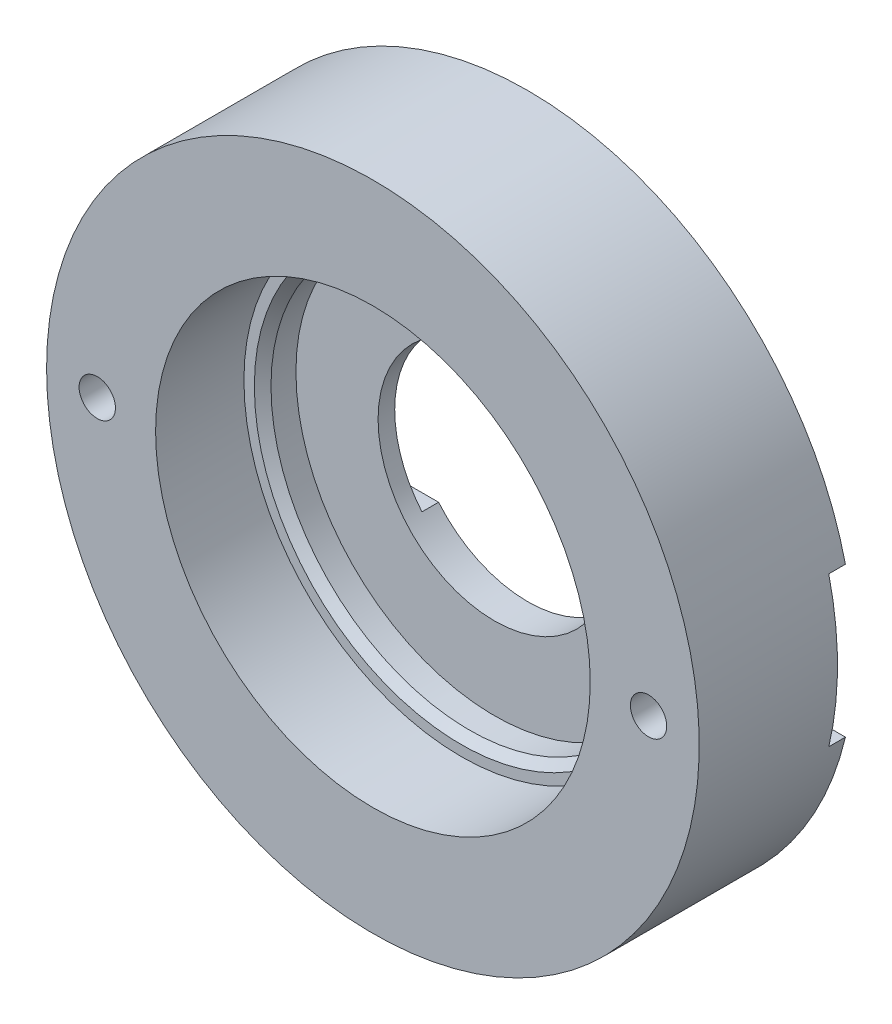
ISO-10303-21;
HEADER;
FILE_DESCRIPTION(('STEP AP214'),'2;1');
FILE_NAME('part.step','',(''),(''),'','','');
FILE_SCHEMA(('AUTOMOTIVE_DESIGN { 1 0 10303 214 1 1 1 1 }'));
ENDSEC;
DATA;
#1=APPLICATION_CONTEXT('core data for automotive mechanical design processes');
#2=APPLICATION_PROTOCOL_DEFINITION('international standard','automotive_design',2000,#1);
#3=PRODUCT_CONTEXT('',#1,'mechanical');
#4=PRODUCT('Part','Part','',(#3));
#5=PRODUCT_RELATED_PRODUCT_CATEGORY('part','',(#4));
#6=PRODUCT_DEFINITION_FORMATION('','',#4);
#7=PRODUCT_DEFINITION_CONTEXT('part definition',#1,'design');
#8=PRODUCT_DEFINITION('design','',#6,#7);
#9=PRODUCT_DEFINITION_SHAPE('','',#8);
#10=(LENGTH_UNIT() NAMED_UNIT(*) SI_UNIT(.MILLI.,.METRE.));
#11=(NAMED_UNIT(*) PLANE_ANGLE_UNIT() SI_UNIT($,.RADIAN.));
#12=(NAMED_UNIT(*) SI_UNIT($,.STERADIAN.) SOLID_ANGLE_UNIT());
#13=UNCERTAINTY_MEASURE_WITH_UNIT(LENGTH_MEASURE(1.E-05),#10,'distance_accuracy_value','');
#14=(GEOMETRIC_REPRESENTATION_CONTEXT(3) GLOBAL_UNCERTAINTY_ASSIGNED_CONTEXT((#13)) GLOBAL_UNIT_ASSIGNED_CONTEXT((#10,
#11,#12)) REPRESENTATION_CONTEXT('',''));
#15=CARTESIAN_POINT('',(0.,0.,0.));
#16=DIRECTION('',(0.,0.,1.));
#17=DIRECTION('',(1.,0.,0.));
#18=AXIS2_PLACEMENT_3D('',#15,#16,#17);
#19=CARTESIAN_POINT('',(0.,0.,-3.52547346479343));
#20=DIRECTION('',(0.,0.,-1.));
#21=DIRECTION('',(-1.,0.,0.));
#22=AXIS2_PLACEMENT_3D('',#19,#20,#21);
#23=PLANE('',#22);
#24=DIRECTION('',(-1.,0.,0.));
#25=VECTOR('',#24,1.);
#26=CARTESIAN_POINT('',(22.5619464921962,-4.5,-3.52547346479343));
#27=LINE('',#26,#25);
#28=CARTESIAN_POINT('',(19.0947333577398,-4.5,-3.52547346479343));
#29=VERTEX_POINT('',#28);
#30=CARTESIAN_POINT('',(5.3619026473818,-4.5,-3.52547346479343));
#31=VERTEX_POINT('',#30);
#32=EDGE_CURVE('E253',#29,#31,#27,.T.);
#33=ORIENTED_EDGE('',*,*,#32,.F.);
#34=CARTESIAN_POINT('',(0.,0.,-3.52547346479343));
#35=DIRECTION('',(0.,0.,-1.));
#36=DIRECTION('',(-1.,0.,0.));
#37=AXIS2_PLACEMENT_3D('',#34,#35,#36);
#38=CIRCLE('',#37,19.6178195017485);
#39=CARTESIAN_POINT('',(-19.0947333577398,-4.5,-3.52547346479343));
#40=VERTEX_POINT('',#39);
#41=EDGE_CURVE('E129',#29,#40,#38,.T.);
#42=ORIENTED_EDGE('',*,*,#41,.T.);
#43=CARTESIAN_POINT('',(-5.3619026473818,-4.5,-3.52547346479343));
#44=VERTEX_POINT('',#43);
#45=EDGE_CURVE('E120',#44,#40,#27,.T.);
#46=ORIENTED_EDGE('',*,*,#45,.F.);
#47=CARTESIAN_POINT('',(0.,0.,-3.52547346479343));
#48=DIRECTION('',(0.,0.,-1.));
#49=DIRECTION('',(-1.,0.,0.));
#50=AXIS2_PLACEMENT_3D('',#47,#48,#49);
#51=CIRCLE('',#50,7.);
#52=EDGE_CURVE('E238',#31,#44,#51,.T.);
#53=ORIENTED_EDGE('',*,*,#52,.F.);
#54=EDGE_LOOP('',(#33,#42,#46,#53));
#55=FACE_BOUND('',#54,.T.);
#56=ADVANCED_FACE('F37',(#55),#23,.T.);
#57=CARTESIAN_POINT('',(-16.57,0.,5.78452653520657));
#58=DIRECTION('',(0.,0.,-1.));
#59=DIRECTION('',(-1.,0.,0.));
#60=AXIS2_PLACEMENT_3D('',#57,#58,#59);
#61=CYLINDRICAL_SURFACE('',#60,1.0922);
#62=CARTESIAN_POINT('',(-16.57,0.,5.78452653520657));
#63=DIRECTION('',(0.,0.,-1.));
#64=DIRECTION('',(-1.,0.,0.));
#65=AXIS2_PLACEMENT_3D('',#62,#63,#64);
#66=CIRCLE('',#65,1.0922);
#67=CARTESIAN_POINT('',(-17.6622,0.,5.78452653520657));
#68=VERTEX_POINT('',#67);
#69=EDGE_CURVE('E220',#68,#68,#66,.T.);
#70=ORIENTED_EDGE('',*,*,#69,.F.);
#71=EDGE_LOOP('',(#70));
#72=FACE_BOUND('',#71,.T.);
#73=CARTESIAN_POINT('',(-16.57,0.,-2.52547346479343));
#74=DIRECTION('',(0.,0.,-1.));
#75=DIRECTION('',(-1.,0.,0.));
#76=AXIS2_PLACEMENT_3D('',#73,#74,#75);
#77=CIRCLE('',#76,1.0922);
#78=CARTESIAN_POINT('',(-17.6622,0.,-2.52547346479343));
#79=VERTEX_POINT('',#78);
#80=EDGE_CURVE('E140',#79,#79,#77,.F.);
#81=ORIENTED_EDGE('',*,*,#80,.F.);
#82=EDGE_LOOP('',(#81));
#83=FACE_BOUND('',#82,.T.);
#84=ADVANCED_FACE('F166',(#72,#83),#61,.F.);
#85=CARTESIAN_POINT('',(16.57,0.,5.78452653520657));
#86=DIRECTION('',(0.,0.,-1.));
#87=DIRECTION('',(-1.,0.,0.));
#88=AXIS2_PLACEMENT_3D('',#85,#86,#87);
#89=CYLINDRICAL_SURFACE('',#88,1.0922);
#90=CARTESIAN_POINT('',(16.57,0.,5.78452653520657));
#91=DIRECTION('',(0.,0.,-1.));
#92=DIRECTION('',(1.,0.,0.));
#93=AXIS2_PLACEMENT_3D('',#90,#91,#92);
#94=CIRCLE('',#93,1.0922);
#95=CARTESIAN_POINT('',(17.6622,0.,5.78452653520657));
#96=VERTEX_POINT('',#95);
#97=EDGE_CURVE('E216',#96,#96,#94,.T.);
#98=ORIENTED_EDGE('',*,*,#97,.F.);
#99=EDGE_LOOP('',(#98));
#100=FACE_BOUND('',#99,.T.);
#101=CARTESIAN_POINT('',(16.57,0.,-2.52547346479343));
#102=DIRECTION('',(0.,0.,-1.));
#103=DIRECTION('',(-1.,0.,0.));
#104=AXIS2_PLACEMENT_3D('',#101,#102,#103);
#105=CIRCLE('',#104,1.0922);
#106=CARTESIAN_POINT('',(15.4778,0.,-2.52547346479343));
#107=VERTEX_POINT('',#106);
#108=EDGE_CURVE('E138',#107,#107,#105,.F.);
#109=ORIENTED_EDGE('',*,*,#108,.F.);
#110=EDGE_LOOP('',(#109));
#111=FACE_BOUND('',#110,.T.);
#112=ADVANCED_FACE('F171',(#100,#111),#89,.F.);
#113=DIRECTION('',(1.,0.,0.));
#114=VECTOR('',#113,1.);
#115=CARTESIAN_POINT('',(22.5619464921962,4.5,-3.52547346479343));
#116=LINE('',#115,#114);
#117=CARTESIAN_POINT('',(-19.0947333577398,4.5,-3.52547346479343));
#118=VERTEX_POINT('',#117);
#119=CARTESIAN_POINT('',(-5.3619026473818,4.5,-3.52547346479343));
#120=VERTEX_POINT('',#119);
#121=EDGE_CURVE('E104',#118,#120,#116,.T.);
#122=ORIENTED_EDGE('',*,*,#121,.F.);
#123=CARTESIAN_POINT('',(19.0947333577398,4.5,-3.52547346479343));
#124=VERTEX_POINT('',#123);
#125=EDGE_CURVE('E117',#118,#124,#38,.T.);
#126=ORIENTED_EDGE('',*,*,#125,.T.);
#127=CARTESIAN_POINT('',(5.3619026473818,4.5,-3.52547346479343));
#128=VERTEX_POINT('',#127);
#129=EDGE_CURVE('E121',#128,#124,#116,.T.);
#130=ORIENTED_EDGE('',*,*,#129,.F.);
#131=EDGE_CURVE('E119',#120,#128,#51,.T.);
#132=ORIENTED_EDGE('',*,*,#131,.F.);
#133=EDGE_LOOP('',(#122,#126,#130,#132));
#134=FACE_BOUND('',#133,.T.);
#135=ADVANCED_FACE('F115',(#134),#23,.T.);
#136=CARTESIAN_POINT('',(0.,0.,-25.4112856059014));
#137=DIRECTION('',(0.,0.,-1.));
#138=DIRECTION('',(-1.,0.,0.));
#139=AXIS2_PLACEMENT_3D('',#136,#137,#138);
#140=CYLINDRICAL_SURFACE('',#139,19.6178195017485);
#141=DIRECTION('',(0.,0.,-1.));
#142=VECTOR('',#141,1.);
#143=CARTESIAN_POINT('',(19.0947333577398,-4.5,-25.4112856059014));
#144=LINE('',#143,#142);
#145=CARTESIAN_POINT('',(19.0947333577398,-4.5,-2.52547346479343));
#146=VERTEX_POINT('',#145);
#147=EDGE_CURVE('E243',#146,#29,#144,.T.);
#148=ORIENTED_EDGE('',*,*,#147,.F.);
#149=CARTESIAN_POINT('',(0.,0.,-2.52547346479343));
#150=DIRECTION('',(0.,0.,-1.));
#151=DIRECTION('',(-1.,0.,0.));
#152=AXIS2_PLACEMENT_3D('',#149,#150,#151);
#153=CIRCLE('',#152,19.6178195017485);
#154=CARTESIAN_POINT('',(19.0947333577398,4.5,-2.52547346479343));
#155=VERTEX_POINT('',#154);
#156=EDGE_CURVE('E110',#146,#155,#153,.F.);
#157=ORIENTED_EDGE('',*,*,#156,.T.);
#158=DIRECTION('',(0.,0.,-1.));
#159=VECTOR('',#158,1.);
#160=CARTESIAN_POINT('',(19.0947333577398,4.5,-25.4112856059014));
#161=LINE('',#160,#159);
#162=EDGE_CURVE('E109',#124,#155,#161,.F.);
#163=ORIENTED_EDGE('',*,*,#162,.F.);
#164=ORIENTED_EDGE('',*,*,#125,.F.);
#165=DIRECTION('',(0.,0.,-1.));
#166=VECTOR('',#165,1.);
#167=CARTESIAN_POINT('',(-19.0947333577398,4.5,-25.4112856059014));
#168=LINE('',#167,#166);
#169=CARTESIAN_POINT('',(-19.0947333577398,4.5,-2.52547346479343));
#170=VERTEX_POINT('',#169);
#171=EDGE_CURVE('E101',#170,#118,#168,.T.);
#172=ORIENTED_EDGE('',*,*,#171,.F.);
#173=CARTESIAN_POINT('',(-19.0947333577398,-4.5,-2.52547346479343));
#174=VERTEX_POINT('',#173);
#175=EDGE_CURVE('E246',#170,#174,#153,.F.);
#176=ORIENTED_EDGE('',*,*,#175,.T.);
#177=DIRECTION('',(0.,0.,-1.));
#178=VECTOR('',#177,1.);
#179=CARTESIAN_POINT('',(-19.0947333577398,-4.5,-25.4112856059014));
#180=LINE('',#179,#178);
#181=EDGE_CURVE('E241',#40,#174,#180,.F.);
#182=ORIENTED_EDGE('',*,*,#181,.F.);
#183=ORIENTED_EDGE('',*,*,#41,.F.);
#184=EDGE_LOOP('',(#148,#157,#163,#164,#172,#176,#182,#183));
#185=FACE_BOUND('',#184,.T.);
#186=CARTESIAN_POINT('',(0.,0.,5.78452653520657));
#187=DIRECTION('',(0.,0.,-1.));
#188=DIRECTION('',(-1.,0.,0.));
#189=AXIS2_PLACEMENT_3D('',#186,#187,#188);
#190=CIRCLE('',#189,19.6178195017485);
#191=CARTESIAN_POINT('',(-19.6178195017485,0.,5.78452653520657));
#192=VERTEX_POINT('',#191);
#193=EDGE_CURVE('E134',#192,#192,#190,.T.);
#194=ORIENTED_EDGE('',*,*,#193,.T.);
#195=EDGE_LOOP('',(#194));
#196=FACE_BOUND('',#195,.T.);
#197=ADVANCED_FACE('F125',(#185,#196),#140,.T.);
#198=CARTESIAN_POINT('',(0.,0.,5.78452653520657));
#199=DIRECTION('',(0.,0.,-1.));
#200=DIRECTION('',(-1.,0.,0.));
#201=AXIS2_PLACEMENT_3D('',#198,#199,#200);
#202=PLANE('',#201);
#203=ORIENTED_EDGE('',*,*,#97,.T.);
#204=EDGE_LOOP('',(#203));
#205=FACE_BOUND('',#204,.T.);
#206=ORIENTED_EDGE('',*,*,#69,.T.);
#207=EDGE_LOOP('',(#206));
#208=FACE_BOUND('',#207,.T.);
#209=ORIENTED_EDGE('',*,*,#193,.F.);
#210=EDGE_LOOP('',(#209));
#211=FACE_BOUND('',#210,.T.);
#212=CARTESIAN_POINT('',(0.,0.,5.78452653520657));
#213=DIRECTION('',(0.,0.,-1.));
#214=DIRECTION('',(-1.,0.,0.));
#215=AXIS2_PLACEMENT_3D('',#212,#213,#214);
#216=CIRCLE('',#215,13.0646195017485);
#217=CARTESIAN_POINT('',(-13.0646195017485,0.,5.78452653520657));
#218=VERTEX_POINT('',#217);
#219=EDGE_CURVE('E226',#218,#218,#216,.T.);
#220=ORIENTED_EDGE('',*,*,#219,.T.);
#221=EDGE_LOOP('',(#220));
#222=FACE_BOUND('',#221,.T.);
#223=ADVANCED_FACE('F181',(#205,#208,#211,#222),#202,.F.);
#224=CARTESIAN_POINT('',(0.,0.,-25.4112856059014));
#225=DIRECTION('',(0.,0.,-1.));
#226=DIRECTION('',(-1.,0.,0.));
#227=AXIS2_PLACEMENT_3D('',#224,#225,#226);
#228=CYLINDRICAL_SURFACE('',#227,13.0646195017485);
#229=ORIENTED_EDGE('',*,*,#219,.F.);
#230=EDGE_LOOP('',(#229));
#231=FACE_BOUND('',#230,.T.);
#232=CARTESIAN_POINT('',(0.,0.,0.474526535206573));
#233=DIRECTION('',(0.,0.,-1.));
#234=DIRECTION('',(-1.,0.,0.));
#235=AXIS2_PLACEMENT_3D('',#232,#233,#234);
#236=CIRCLE('',#235,13.0646195017485);
#237=CARTESIAN_POINT('',(-13.0646195017485,0.,0.474526535206573));
#238=VERTEX_POINT('',#237);
#239=EDGE_CURVE('E227',#238,#238,#236,.T.);
#240=ORIENTED_EDGE('',*,*,#239,.T.);
#241=EDGE_LOOP('',(#240));
#242=FACE_BOUND('',#241,.T.);
#243=ADVANCED_FACE('F206',(#231,#242),#228,.F.);
#244=CARTESIAN_POINT('',(0.,0.,0.474526535206571));
#245=DIRECTION('',(0.,0.,-1.));
#246=DIRECTION('',(-1.,0.,0.));
#247=AXIS2_PLACEMENT_3D('',#244,#245,#246);
#248=PLANE('',#247);
#249=CARTESIAN_POINT('',(0.,0.,0.474526535206571));
#250=DIRECTION('',(0.,0.,-1.));
#251=DIRECTION('',(-1.,0.,0.));
#252=AXIS2_PLACEMENT_3D('',#249,#250,#251);
#253=CIRCLE('',#252,12.438);
#254=CARTESIAN_POINT('',(-12.438,0.,0.474526535206571));
#255=VERTEX_POINT('',#254);
#256=EDGE_CURVE('E45',#255,#255,#253,.T.);
#257=ORIENTED_EDGE('',*,*,#256,.T.);
#258=EDGE_LOOP('',(#257));
#259=FACE_BOUND('',#258,.T.);
#260=ORIENTED_EDGE('',*,*,#239,.F.);
#261=EDGE_LOOP('',(#260));
#262=FACE_BOUND('',#261,.T.);
#263=ADVANCED_FACE('F152',(#259,#262),#248,.F.);
#264=CARTESIAN_POINT('',(0.,0.,-25.4112856059014));
#265=DIRECTION('',(0.,0.,-1.));
#266=DIRECTION('',(-1.,0.,0.));
#267=AXIS2_PLACEMENT_3D('',#264,#265,#266);
#268=CYLINDRICAL_SURFACE('',#267,11.938);
#269=CARTESIAN_POINT('',(0.,0.,-0.0254734647934171));
#270=DIRECTION('',(0.,0.,-1.));
#271=DIRECTION('',(-1.,0.,0.));
#272=AXIS2_PLACEMENT_3D('',#269,#270,#271);
#273=CIRCLE('',#272,11.938);
#274=CARTESIAN_POINT('',(-11.938,0.,-0.0254734647934171));
#275=VERTEX_POINT('',#274);
#276=EDGE_CURVE('E11',#275,#275,#273,.F.);
#277=ORIENTED_EDGE('',*,*,#276,.T.);
#278=EDGE_LOOP('',(#277));
#279=FACE_BOUND('',#278,.T.);
#280=CARTESIAN_POINT('',(0.,0.,-1.52547346479343));
#281=DIRECTION('',(0.,0.,-1.));
#282=DIRECTION('',(-1.,0.,0.));
#283=AXIS2_PLACEMENT_3D('',#280,#281,#282);
#284=CIRCLE('',#283,11.938);
#285=CARTESIAN_POINT('',(-11.938,0.,-1.52547346479343));
#286=VERTEX_POINT('',#285);
#287=EDGE_CURVE('E229',#286,#286,#284,.T.);
#288=ORIENTED_EDGE('',*,*,#287,.T.);
#289=EDGE_LOOP('',(#288));
#290=FACE_BOUND('',#289,.T.);
#291=ADVANCED_FACE('F199',(#279,#290),#268,.F.);
#292=CARTESIAN_POINT('',(0.,0.,-1.52547346479343));
#293=DIRECTION('',(0.,0.,-1.));
#294=DIRECTION('',(-1.,0.,0.));
#295=AXIS2_PLACEMENT_3D('',#292,#293,#294);
#296=PLANE('',#295);
#297=ORIENTED_EDGE('',*,*,#287,.F.);
#298=EDGE_LOOP('',(#297));
#299=FACE_BOUND('',#298,.T.);
#300=CARTESIAN_POINT('',(0.,0.,-1.52547346479343));
#301=DIRECTION('',(0.,0.,-1.));
#302=DIRECTION('',(-1.,0.,0.));
#303=AXIS2_PLACEMENT_3D('',#300,#301,#302);
#304=CIRCLE('',#303,7.);
#305=CARTESIAN_POINT('',(-7.,0.,-1.52547346479343));
#306=VERTEX_POINT('',#305);
#307=EDGE_CURVE('E234',#306,#306,#304,.T.);
#308=ORIENTED_EDGE('',*,*,#307,.T.);
#309=EDGE_LOOP('',(#308));
#310=FACE_BOUND('',#309,.T.);
#311=ADVANCED_FACE('F195',(#299,#310),#296,.F.);
#312=CARTESIAN_POINT('',(0.,0.,-25.4112856059014));
#313=DIRECTION('',(0.,0.,-1.));
#314=DIRECTION('',(-1.,0.,0.));
#315=AXIS2_PLACEMENT_3D('',#312,#313,#314);
#316=CYLINDRICAL_SURFACE('',#315,7.);
#317=CARTESIAN_POINT('',(0.,0.,-2.52547346479343));
#318=DIRECTION('',(0.,0.,-1.));
#319=DIRECTION('',(-1.,0.,0.));
#320=AXIS2_PLACEMENT_3D('',#317,#318,#319);
#321=CIRCLE('',#320,7.);
#322=CARTESIAN_POINT('',(5.3619026473818,-4.5,-2.52547346479343));
#323=VERTEX_POINT('',#322);
#324=CARTESIAN_POINT('',(5.3619026473818,4.5,-2.52547346479343));
#325=VERTEX_POINT('',#324);
#326=EDGE_CURVE('E248',#323,#325,#321,.F.);
#327=ORIENTED_EDGE('',*,*,#326,.F.);
#328=DIRECTION('',(0.,0.,-1.));
#329=VECTOR('',#328,1.);
#330=CARTESIAN_POINT('',(5.3619026473818,-4.5,-25.4112856059014));
#331=LINE('',#330,#329);
#332=EDGE_CURVE('E147',#323,#31,#331,.T.);
#333=ORIENTED_EDGE('',*,*,#332,.T.);
#334=ORIENTED_EDGE('',*,*,#52,.T.);
#335=DIRECTION('',(0.,0.,-1.));
#336=VECTOR('',#335,1.);
#337=CARTESIAN_POINT('',(-5.3619026473818,-4.5,-25.4112856059014));
#338=LINE('',#337,#336);
#339=CARTESIAN_POINT('',(-5.3619026473818,-4.5,-2.52547346479343));
#340=VERTEX_POINT('',#339);
#341=EDGE_CURVE('E131',#44,#340,#338,.F.);
#342=ORIENTED_EDGE('',*,*,#341,.T.);
#343=CARTESIAN_POINT('',(-5.3619026473818,4.5,-2.52547346479343));
#344=VERTEX_POINT('',#343);
#345=EDGE_CURVE('E249',#344,#340,#321,.F.);
#346=ORIENTED_EDGE('',*,*,#345,.F.);
#347=DIRECTION('',(0.,0.,-1.));
#348=VECTOR('',#347,1.);
#349=CARTESIAN_POINT('',(-5.3619026473818,4.5,-25.4112856059014));
#350=LINE('',#349,#348);
#351=EDGE_CURVE('E128',#344,#120,#350,.T.);
#352=ORIENTED_EDGE('',*,*,#351,.T.);
#353=ORIENTED_EDGE('',*,*,#131,.T.);
#354=DIRECTION('',(0.,0.,-1.));
#355=VECTOR('',#354,1.);
#356=CARTESIAN_POINT('',(5.3619026473818,4.5,-25.4112856059014));
#357=LINE('',#356,#355);
#358=EDGE_CURVE('E144',#128,#325,#357,.F.);
#359=ORIENTED_EDGE('',*,*,#358,.T.);
#360=EDGE_LOOP('',(#327,#333,#334,#342,#346,#352,#353,#359));
#361=FACE_BOUND('',#360,.T.);
#362=ORIENTED_EDGE('',*,*,#307,.F.);
#363=EDGE_LOOP('',(#362));
#364=FACE_BOUND('',#363,.T.);
#365=ADVANCED_FACE('F192',(#361,#364),#316,.F.);
#366=CARTESIAN_POINT('',(0.,0.,-2.52547346479343));
#367=DIRECTION('',(0.,0.,-1.));
#368=DIRECTION('',(-1.,0.,0.));
#369=AXIS2_PLACEMENT_3D('',#366,#367,#368);
#370=PLANE('',#369);
#371=ORIENTED_EDGE('',*,*,#108,.T.);
#372=EDGE_LOOP('',(#371));
#373=FACE_BOUND('',#372,.T.);
#374=DIRECTION('',(-1.,0.,0.));
#375=VECTOR('',#374,1.);
#376=CARTESIAN_POINT('',(22.5619464921962,-4.5,-2.52547346479343));
#377=LINE('',#376,#375);
#378=EDGE_CURVE('E52',#146,#323,#377,.T.);
#379=ORIENTED_EDGE('',*,*,#378,.T.);
#380=ORIENTED_EDGE('',*,*,#326,.T.);
#381=DIRECTION('',(1.,0.,0.));
#382=VECTOR('',#381,1.);
#383=CARTESIAN_POINT('',(22.5619464921962,4.5,-2.52547346479343));
#384=LINE('',#383,#382);
#385=EDGE_CURVE('E258',#325,#155,#384,.T.);
#386=ORIENTED_EDGE('',*,*,#385,.T.);
#387=ORIENTED_EDGE('',*,*,#156,.F.);
#388=EDGE_LOOP('',(#379,#380,#386,#387));
#389=FACE_BOUND('',#388,.T.);
#390=ADVANCED_FACE('F163',(#373,#389),#370,.T.);
#391=CARTESIAN_POINT('',(22.5619464921962,4.5,-2.52547346479343));
#392=DIRECTION('',(0.,1.,0.));
#393=DIRECTION('',(0.,0.,1.));
#394=AXIS2_PLACEMENT_3D('',#391,#392,#393);
#395=PLANE('',#394);
#396=ORIENTED_EDGE('',*,*,#162,.T.);
#397=ORIENTED_EDGE('',*,*,#385,.F.);
#398=ORIENTED_EDGE('',*,*,#358,.F.);
#399=ORIENTED_EDGE('',*,*,#129,.T.);
#400=EDGE_LOOP('',(#396,#397,#398,#399));
#401=FACE_BOUND('',#400,.T.);
#402=ADVANCED_FACE('F189',(#401),#395,.F.);
#403=CARTESIAN_POINT('',(22.5619464921962,-4.5,-2.52547346479343));
#404=DIRECTION('',(0.,-1.,0.));
#405=DIRECTION('',(0.,0.,-1.));
#406=AXIS2_PLACEMENT_3D('',#403,#404,#405);
#407=PLANE('',#406);
#408=ORIENTED_EDGE('',*,*,#147,.T.);
#409=ORIENTED_EDGE('',*,*,#32,.T.);
#410=ORIENTED_EDGE('',*,*,#332,.F.);
#411=ORIENTED_EDGE('',*,*,#378,.F.);
#412=EDGE_LOOP('',(#408,#409,#410,#411));
#413=FACE_BOUND('',#412,.T.);
#414=ADVANCED_FACE('F262',(#413),#407,.F.);
#415=ORIENTED_EDGE('',*,*,#181,.T.);
#416=EDGE_CURVE('E255',#340,#174,#377,.T.);
#417=ORIENTED_EDGE('',*,*,#416,.F.);
#418=ORIENTED_EDGE('',*,*,#341,.F.);
#419=ORIENTED_EDGE('',*,*,#45,.T.);
#420=EDGE_LOOP('',(#415,#417,#418,#419));
#421=FACE_BOUND('',#420,.T.);
#422=ADVANCED_FACE('F271',(#421),#407,.F.);
#423=ORIENTED_EDGE('',*,*,#171,.T.);
#424=ORIENTED_EDGE('',*,*,#121,.T.);
#425=ORIENTED_EDGE('',*,*,#351,.F.);
#426=EDGE_CURVE('E60',#170,#344,#384,.T.);
#427=ORIENTED_EDGE('',*,*,#426,.F.);
#428=EDGE_LOOP('',(#423,#424,#425,#427));
#429=FACE_BOUND('',#428,.T.);
#430=ADVANCED_FACE('F103',(#429),#395,.F.);
#431=ORIENTED_EDGE('',*,*,#80,.T.);
#432=EDGE_LOOP('',(#431));
#433=FACE_BOUND('',#432,.T.);
#434=ORIENTED_EDGE('',*,*,#426,.T.);
#435=ORIENTED_EDGE('',*,*,#345,.T.);
#436=ORIENTED_EDGE('',*,*,#416,.T.);
#437=ORIENTED_EDGE('',*,*,#175,.F.);
#438=EDGE_LOOP('',(#434,#435,#436,#437));
#439=FACE_BOUND('',#438,.T.);
#440=ADVANCED_FACE('F156',(#433,#439),#370,.T.);
#441=CARTESIAN_POINT('',(0.,0.,0.474526535206573));
#442=DIRECTION('',(0.,0.,1.));
#443=DIRECTION('',(1.,0.,0.));
#444=AXIS2_PLACEMENT_3D('',#441,#442,#443);
#445=CONICAL_SURFACE('',#444,12.438,0.785398163397447);
#446=ORIENTED_EDGE('',*,*,#276,.F.);
#447=EDGE_LOOP('',(#446));
#448=FACE_BOUND('',#447,.T.);
#449=ORIENTED_EDGE('',*,*,#256,.F.);
#450=EDGE_LOOP('',(#449));
#451=FACE_BOUND('',#450,.T.);
#452=ADVANCED_FACE('F39',(#448,#451),#445,.F.);
#453=CLOSED_SHELL('',(#56,#84,#112,#135,#197,#223,#243,#263,#291,#311,#365,#390,#402,#414,#422,
#430,#440,#452));
#454=MANIFOLD_SOLID_BREP('B2',#453);
#455=ADVANCED_BREP_SHAPE_REPRESENTATION('',(#18,#454),#14);
#456=SHAPE_DEFINITION_REPRESENTATION(#9,#455);
ENDSEC;
END-ISO-10303-21;
